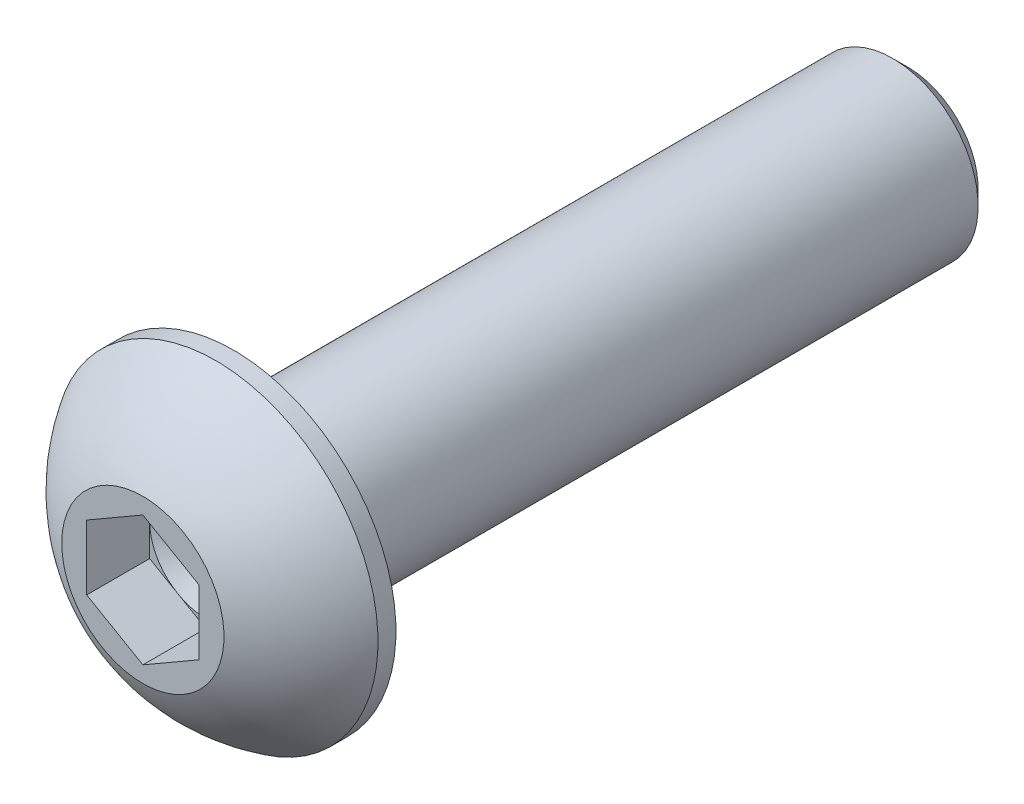
ISO-10303-21;
HEADER;
FILE_DESCRIPTION(('STEP AP214'),'2;1');
FILE_NAME('part.step','',(''),(''),'','','');
FILE_SCHEMA(('AUTOMOTIVE_DESIGN { 1 0 10303 214 1 1 1 1 }'));
ENDSEC;
DATA;
#1=APPLICATION_CONTEXT('core data for automotive mechanical design processes');
#2=APPLICATION_PROTOCOL_DEFINITION('international standard','automotive_design',2000,#1);
#3=PRODUCT_CONTEXT('',#1,'mechanical');
#4=PRODUCT('Part','Part','',(#3));
#5=PRODUCT_RELATED_PRODUCT_CATEGORY('part','',(#4));
#6=PRODUCT_DEFINITION_FORMATION('','',#4);
#7=PRODUCT_DEFINITION_CONTEXT('part definition',#1,'design');
#8=PRODUCT_DEFINITION('design','',#6,#7);
#9=PRODUCT_DEFINITION_SHAPE('','',#8);
#10=(LENGTH_UNIT() NAMED_UNIT(*) SI_UNIT(.MILLI.,.METRE.));
#11=(NAMED_UNIT(*) PLANE_ANGLE_UNIT() SI_UNIT($,.RADIAN.));
#12=(NAMED_UNIT(*) SI_UNIT($,.STERADIAN.) SOLID_ANGLE_UNIT());
#13=UNCERTAINTY_MEASURE_WITH_UNIT(LENGTH_MEASURE(1.E-05),#10,'distance_accuracy_value','');
#14=(GEOMETRIC_REPRESENTATION_CONTEXT(3) GLOBAL_UNCERTAINTY_ASSIGNED_CONTEXT((#13)) GLOBAL_UNIT_ASSIGNED_CONTEXT((#10,
#11,#12)) REPRESENTATION_CONTEXT('',''));
#15=CARTESIAN_POINT('',(0.,0.,0.));
#16=DIRECTION('',(0.,0.,1.));
#17=DIRECTION('',(1.,0.,0.));
#18=AXIS2_PLACEMENT_3D('',#15,#16,#17);
#19=CARTESIAN_POINT('',(0.,0.,-1.778));
#20=DIRECTION('',(0.,0.,1.));
#21=DIRECTION('',(1.,0.,0.));
#22=AXIS2_PLACEMENT_3D('',#19,#20,#21);
#23=PLANE('',#22);
#24=CARTESIAN_POINT('',(0.,0.,-1.778));
#25=DIRECTION('',(0.,0.,1.));
#26=DIRECTION('',(1.,0.,0.));
#27=AXIS2_PLACEMENT_3D('',#24,#25,#26);
#28=CIRCLE('',#27,1.5875);
#29=CARTESIAN_POINT('',(1.5875,0.,-1.778));
#30=VERTEX_POINT('',#29);
#31=CARTESIAN_POINT('',(0.79375,1.3748153285078,-1.778));
#32=VERTEX_POINT('',#31);
#33=EDGE_CURVE('E96',#30,#32,#28,.T.);
#34=ORIENTED_EDGE('',*,*,#33,.F.);
#35=DIRECTION('',(0.,-1.,0.));
#36=VECTOR('',#35,1.);
#37=CARTESIAN_POINT('',(1.5875,0.,-1.778));
#38=LINE('',#37,#36);
#39=CARTESIAN_POINT('',(1.5875,0.916543552338531,-1.778));
#40=VERTEX_POINT('',#39);
#41=EDGE_CURVE('E120',#40,#30,#38,.T.);
#42=ORIENTED_EDGE('',*,*,#41,.F.);
#43=DIRECTION('',(0.866025403784438,-0.5,0.));
#44=VECTOR('',#43,1.);
#45=CARTESIAN_POINT('',(0.79375,1.3748153285078,-1.778));
#46=LINE('',#45,#44);
#47=EDGE_CURVE('E118',#32,#40,#46,.T.);
#48=ORIENTED_EDGE('',*,*,#47,.F.);
#49=EDGE_LOOP('',(#34,#42,#48));
#50=FACE_BOUND('',#49,.T.);
#51=ADVANCED_FACE('F17',(#50),#23,.T.);
#52=CARTESIAN_POINT('',(-0.79375,1.37481532850779,-1.778));
#53=VERTEX_POINT('',#52);
#54=EDGE_CURVE('E98',#32,#53,#28,.T.);
#55=ORIENTED_EDGE('',*,*,#54,.F.);
#56=CARTESIAN_POINT('',(0.,1.83308710467706,-1.778));
#57=VERTEX_POINT('',#56);
#58=EDGE_CURVE('E113',#57,#32,#46,.T.);
#59=ORIENTED_EDGE('',*,*,#58,.F.);
#60=DIRECTION('',(0.866025403784437,0.5,0.));
#61=VECTOR('',#60,1.);
#62=CARTESIAN_POINT('',(-0.79375,1.37481532850779,-1.778));
#63=LINE('',#62,#61);
#64=EDGE_CURVE('E114',#53,#57,#63,.T.);
#65=ORIENTED_EDGE('',*,*,#64,.F.);
#66=EDGE_LOOP('',(#55,#59,#65));
#67=FACE_BOUND('',#66,.T.);
#68=ADVANCED_FACE('F111',(#67),#23,.T.);
#69=CARTESIAN_POINT('',(-1.5875,0.,-1.778));
#70=VERTEX_POINT('',#69);
#71=EDGE_CURVE('E117',#53,#70,#28,.T.);
#72=ORIENTED_EDGE('',*,*,#71,.F.);
#73=CARTESIAN_POINT('',(-1.5875,0.916543552338527,-1.778));
#74=VERTEX_POINT('',#73);
#75=EDGE_CURVE('E133',#74,#53,#63,.T.);
#76=ORIENTED_EDGE('',*,*,#75,.F.);
#77=DIRECTION('',(0.,1.,0.));
#78=VECTOR('',#77,1.);
#79=CARTESIAN_POINT('',(-1.5875,0.,-1.778));
#80=LINE('',#79,#78);
#81=EDGE_CURVE('E137',#70,#74,#80,.T.);
#82=ORIENTED_EDGE('',*,*,#81,.F.);
#83=EDGE_LOOP('',(#72,#76,#82));
#84=FACE_BOUND('',#83,.T.);
#85=ADVANCED_FACE('F227',(#84),#23,.T.);
#86=CARTESIAN_POINT('',(-0.79375,-1.3748153285078,-1.778));
#87=VERTEX_POINT('',#86);
#88=EDGE_CURVE('E252',#70,#87,#28,.T.);
#89=ORIENTED_EDGE('',*,*,#88,.F.);
#90=CARTESIAN_POINT('',(-1.5875,-0.916543552338531,-1.778));
#91=VERTEX_POINT('',#90);
#92=EDGE_CURVE('E138',#91,#70,#80,.T.);
#93=ORIENTED_EDGE('',*,*,#92,.F.);
#94=DIRECTION('',(-0.866025403784438,0.5,0.));
#95=VECTOR('',#94,1.);
#96=CARTESIAN_POINT('',(-0.79375,-1.3748153285078,-1.778));
#97=LINE('',#96,#95);
#98=EDGE_CURVE('E142',#87,#91,#97,.T.);
#99=ORIENTED_EDGE('',*,*,#98,.F.);
#100=EDGE_LOOP('',(#89,#93,#99));
#101=FACE_BOUND('',#100,.T.);
#102=ADVANCED_FACE('F239',(#101),#23,.T.);
#103=CARTESIAN_POINT('',(0.79375,-1.37481532850779,-1.778));
#104=VERTEX_POINT('',#103);
#105=EDGE_CURVE('E33',#87,#104,#28,.T.);
#106=ORIENTED_EDGE('',*,*,#105,.F.);
#107=CARTESIAN_POINT('',(0.,-1.83308710467706,-1.778));
#108=VERTEX_POINT('',#107);
#109=EDGE_CURVE('E143',#108,#87,#97,.T.);
#110=ORIENTED_EDGE('',*,*,#109,.F.);
#111=DIRECTION('',(-0.866025403784437,-0.5,0.));
#112=VECTOR('',#111,1.);
#113=CARTESIAN_POINT('',(0.79375,-1.37481532850779,-1.778));
#114=LINE('',#113,#112);
#115=EDGE_CURVE('E147',#104,#108,#114,.T.);
#116=ORIENTED_EDGE('',*,*,#115,.F.);
#117=EDGE_LOOP('',(#106,#110,#116));
#118=FACE_BOUND('',#117,.T.);
#119=ADVANCED_FACE('F232',(#118),#23,.T.);
#120=CARTESIAN_POINT('',(-1.146175,0.,0.));
#121=DIRECTION('',(0.,0.,1.));
#122=DIRECTION('',(1.,0.,0.));
#123=AXIS2_PLACEMENT_3D('',#120,#121,#122);
#124=PLANE('',#123);
#125=CARTESIAN_POINT('',(0.,0.,0.));
#126=DIRECTION('',(0.,0.,-1.));
#127=DIRECTION('',(-1.,0.,0.));
#128=AXIS2_PLACEMENT_3D('',#125,#126,#127);
#129=CIRCLE('',#128,2.29235);
#130=CARTESIAN_POINT('',(-2.29235000000001,0.,0.));
#131=VERTEX_POINT('',#130);
#132=EDGE_CURVE('E196',#131,#131,#129,.T.);
#133=ORIENTED_EDGE('',*,*,#132,.F.);
#134=EDGE_LOOP('',(#133));
#135=FACE_BOUND('',#134,.T.);
#136=DIRECTION('',(0.866025403784437,0.5,0.));
#137=VECTOR('',#136,1.);
#138=CARTESIAN_POINT('',(-0.79375,1.37481532850779,0.));
#139=LINE('',#138,#137);
#140=CARTESIAN_POINT('',(-1.5875,0.916543552338527,0.));
#141=VERTEX_POINT('',#140);
#142=CARTESIAN_POINT('',(0.,1.83308710467706,0.));
#143=VERTEX_POINT('',#142);
#144=EDGE_CURVE('E159',#141,#143,#139,.T.);
#145=ORIENTED_EDGE('',*,*,#144,.T.);
#146=DIRECTION('',(0.866025403784438,-0.5,0.));
#147=VECTOR('',#146,1.);
#148=CARTESIAN_POINT('',(0.79375,1.3748153285078,0.));
#149=LINE('',#148,#147);
#150=CARTESIAN_POINT('',(1.5875,0.916543552338531,0.));
#151=VERTEX_POINT('',#150);
#152=EDGE_CURVE('E106',#143,#151,#149,.T.);
#153=ORIENTED_EDGE('',*,*,#152,.T.);
#154=DIRECTION('',(0.,-1.,0.));
#155=VECTOR('',#154,1.);
#156=CARTESIAN_POINT('',(1.5875,0.,0.));
#157=LINE('',#156,#155);
#158=CARTESIAN_POINT('',(1.5875,-0.916543552338531,0.));
#159=VERTEX_POINT('',#158);
#160=EDGE_CURVE('E124',#151,#159,#157,.T.);
#161=ORIENTED_EDGE('',*,*,#160,.T.);
#162=DIRECTION('',(-0.866025403784437,-0.5,0.));
#163=VECTOR('',#162,1.);
#164=CARTESIAN_POINT('',(0.79375,-1.37481532850779,0.));
#165=LINE('',#164,#163);
#166=CARTESIAN_POINT('',(0.,-1.83308710467706,0.));
#167=VERTEX_POINT('',#166);
#168=EDGE_CURVE('E41',#159,#167,#165,.T.);
#169=ORIENTED_EDGE('',*,*,#168,.T.);
#170=DIRECTION('',(-0.866025403784438,0.5,0.));
#171=VECTOR('',#170,1.);
#172=CARTESIAN_POINT('',(-0.79375,-1.3748153285078,0.));
#173=LINE('',#172,#171);
#174=CARTESIAN_POINT('',(-1.5875,-0.916543552338531,0.));
#175=VERTEX_POINT('',#174);
#176=EDGE_CURVE('E167',#167,#175,#173,.T.);
#177=ORIENTED_EDGE('',*,*,#176,.T.);
#178=DIRECTION('',(0.,1.,0.));
#179=VECTOR('',#178,1.);
#180=CARTESIAN_POINT('',(-1.5875,0.,0.));
#181=LINE('',#180,#179);
#182=EDGE_CURVE('E163',#175,#141,#181,.T.);
#183=ORIENTED_EDGE('',*,*,#182,.T.);
#184=EDGE_LOOP('',(#145,#153,#161,#169,#177,#183));
#185=FACE_BOUND('',#184,.T.);
#186=ADVANCED_FACE('F238',(#135,#185),#124,.T.);
#187=CARTESIAN_POINT('',(0.,0.,1.48381805047393));
#188=DIRECTION('',(0.,0.,-1.));
#189=DIRECTION('',(-1.,0.,0.));
#190=AXIS2_PLACEMENT_3D('',#187,#188,#189);
#191=CYLINDRICAL_SURFACE('',#190,4.5847);
#192=CARTESIAN_POINT('',(0.,0.,-2.0574));
#193=DIRECTION('',(0.,0.,-1.));
#194=DIRECTION('',(-1.,0.,0.));
#195=AXIS2_PLACEMENT_3D('',#192,#193,#194);
#196=CIRCLE('',#195,4.5847);
#197=CARTESIAN_POINT('',(-4.5847,0.,-2.0574));
#198=VERTEX_POINT('',#197);
#199=EDGE_CURVE('E192',#198,#198,#196,.T.);
#200=ORIENTED_EDGE('',*,*,#199,.T.);
#201=EDGE_LOOP('',(#200));
#202=FACE_BOUND('',#201,.T.);
#203=CARTESIAN_POINT('',(0.,0.,-2.5654));
#204=DIRECTION('',(0.,0.,-1.));
#205=DIRECTION('',(-1.,0.,0.));
#206=AXIS2_PLACEMENT_3D('',#203,#204,#205);
#207=CIRCLE('',#206,4.5847);
#208=CARTESIAN_POINT('',(-4.5847,0.,-2.5654));
#209=VERTEX_POINT('',#208);
#210=EDGE_CURVE('E208',#209,#209,#207,.T.);
#211=ORIENTED_EDGE('',*,*,#210,.F.);
#212=EDGE_LOOP('',(#211));
#213=FACE_BOUND('',#212,.T.);
#214=ADVANCED_FACE('F244',(#202,#213),#191,.T.);
#215=CARTESIAN_POINT('',(-3.68935,0.,-2.5654));
#216=DIRECTION('',(0.,0.,-1.));
#217=DIRECTION('',(-1.,0.,0.));
#218=AXIS2_PLACEMENT_3D('',#215,#216,#217);
#219=PLANE('',#218);
#220=ORIENTED_EDGE('',*,*,#210,.T.);
#221=EDGE_LOOP('',(#220));
#222=FACE_BOUND('',#221,.T.);
#223=CARTESIAN_POINT('',(0.,0.,-2.5654));
#224=DIRECTION('',(0.,0.,-1.));
#225=DIRECTION('',(-1.,0.,0.));
#226=AXIS2_PLACEMENT_3D('',#223,#224,#225);
#227=CIRCLE('',#226,2.794);
#228=CARTESIAN_POINT('',(-2.794,0.,-2.5654));
#229=VERTEX_POINT('',#228);
#230=EDGE_CURVE('E204',#229,#229,#227,.T.);
#231=ORIENTED_EDGE('',*,*,#230,.F.);
#232=EDGE_LOOP('',(#231));
#233=FACE_BOUND('',#232,.T.);
#234=ADVANCED_FACE('F303',(#222,#233),#219,.T.);
#235=CARTESIAN_POINT('',(0.,0.,-2.9464));
#236=DIRECTION('',(0.,0.,-1.));
#237=DIRECTION('',(-1.,0.,0.));
#238=AXIS2_PLACEMENT_3D('',#235,#236,#237);
#239=TOROIDAL_SURFACE('',#238,2.794,0.381);
#240=ORIENTED_EDGE('',*,*,#230,.T.);
#241=EDGE_LOOP('',(#240));
#242=FACE_BOUND('',#241,.T.);
#243=CARTESIAN_POINT('',(0.,0.,-2.9464));
#244=DIRECTION('',(0.,0.,-1.));
#245=DIRECTION('',(-1.,0.,0.));
#246=AXIS2_PLACEMENT_3D('',#243,#244,#245);
#247=CIRCLE('',#246,2.413);
#248=CARTESIAN_POINT('',(-2.413,0.,-2.9464));
#249=VERTEX_POINT('',#248);
#250=EDGE_CURVE('E200',#249,#249,#247,.T.);
#251=ORIENTED_EDGE('',*,*,#250,.F.);
#252=EDGE_LOOP('',(#251));
#253=FACE_BOUND('',#252,.T.);
#254=ADVANCED_FACE('F299',(#242,#253),#239,.F.);
#255=CARTESIAN_POINT('',(0.,0.,1.48381805047393));
#256=DIRECTION('',(0.,0.,-1.));
#257=DIRECTION('',(-1.,0.,0.));
#258=AXIS2_PLACEMENT_3D('',#255,#256,#257);
#259=CYLINDRICAL_SURFACE('',#258,2.413);
#260=CARTESIAN_POINT('',(0.,0.,-21.18645761938));
#261=DIRECTION('',(0.,0.,-1.));
#262=DIRECTION('',(-1.,0.,0.));
#263=AXIS2_PLACEMENT_3D('',#260,#261,#262);
#264=CIRCLE('',#263,2.413);
#265=CARTESIAN_POINT('',(-2.413,0.,-21.18645761938));
#266=VERTEX_POINT('',#265);
#267=EDGE_CURVE('E11',#266,#266,#264,.F.);
#268=ORIENTED_EDGE('',*,*,#267,.T.);
#269=EDGE_LOOP('',(#268));
#270=FACE_BOUND('',#269,.T.);
#271=ORIENTED_EDGE('',*,*,#250,.T.);
#272=EDGE_LOOP('',(#271));
#273=FACE_BOUND('',#272,.T.);
#274=ADVANCED_FACE('F296',(#270,#273),#259,.T.);
#275=CARTESIAN_POINT('',(-1.2065,0.,-21.6154));
#276=DIRECTION('',(0.,0.,-1.));
#277=DIRECTION('',(-1.,0.,0.));
#278=AXIS2_PLACEMENT_3D('',#275,#276,#277);
#279=PLANE('',#278);
#280=CARTESIAN_POINT('',(0.,0.,-21.6154));
#281=DIRECTION('',(0.,0.,-1.));
#282=DIRECTION('',(-1.,0.,0.));
#283=AXIS2_PLACEMENT_3D('',#280,#281,#282);
#284=CIRCLE('',#283,1.98405761938);
#285=CARTESIAN_POINT('',(-1.98405761938,0.,-21.6154));
#286=VERTEX_POINT('',#285);
#287=EDGE_CURVE('E26',#286,#286,#284,.T.);
#288=ORIENTED_EDGE('',*,*,#287,.T.);
#289=EDGE_LOOP('',(#288));
#290=FACE_BOUND('',#289,.T.);
#291=ADVANCED_FACE('F216',(#290),#279,.T.);
#292=CARTESIAN_POINT('',(0.,0.,-4.85989606481481));
#293=DIRECTION('',(0.,0.,-1.));
#294=DIRECTION('',(-1.,0.,0.));
#295=AXIS2_PLACEMENT_3D('',#292,#293,#294);
#296=SPHERICAL_SURFACE('',#295,5.37340285883187);
#297=CARTESIAN_POINT('',(-4.5847,0.,-2.0574));
#298=CARTESIAN_POINT('',(-4.56772775071365,0.,-2.02963444466225));
#299=CARTESIAN_POINT('',(-4.55050321576171,0.,-2.00202310563314));
#300=CARTESIAN_POINT('',(-4.51555538986232,0.,-1.94711789153313));
#301=CARTESIAN_POINT('',(-4.49783209891487,0.,-1.91982401646224));
#302=CARTESIAN_POINT('',(-4.4618925763601,0.,-1.8655627616196));
#303=CARTESIAN_POINT('',(-4.44367634475278,0.,-1.83859538184787));
#304=CARTESIAN_POINT('',(-4.40675696303686,0.,-1.78499601309644));
#305=CARTESIAN_POINT('',(-4.38805381292827,0.,-1.75836402411674));
#306=CARTESIAN_POINT('',(-4.35016676527117,0.,-1.70544422925954));
#307=CARTESIAN_POINT('',(-4.33098286772266,0.,-1.67915642338203));
#308=CARTESIAN_POINT('',(-4.29214065809995,0.,-1.62693367141508));
#309=CARTESIAN_POINT('',(-4.27248234602574,0.,-1.60099872532564));
#310=CARTESIAN_POINT('',(-4.23269779601254,0.,-1.54949025368841));
#311=CARTESIAN_POINT('',(-4.21257155807355,0.,-1.52391672814064));
#312=CARTESIAN_POINT('',(-4.17185779967265,0.,-1.4731395388975));
#313=CARTESIAN_POINT('',(-4.15127027921075,0.,-1.44793587520214));
#314=CARTESIAN_POINT('',(-4.10964075130566,0.,-1.39790672892889));
#315=CARTESIAN_POINT('',(-4.08859874386249,0.,-1.37308124635099));
#316=CARTESIAN_POINT('',(-4.04606718757048,0.,-1.32381665673685));
#317=CARTESIAN_POINT('',(-4.02457763872164,0.,-1.29937754970059));
#318=CARTESIAN_POINT('',(-3.98115809291457,0.,-1.25089377806135));
#319=CARTESIAN_POINT('',(-3.95922809595633,0.,-1.22684911345837));
#320=CARTESIAN_POINT('',(-3.91493489261154,0.,-1.1791621633785));
#321=CARTESIAN_POINT('',(-3.892571686225,0.,-1.15551987790161));
#322=CARTESIAN_POINT('',(-3.84741944569869,0.,-1.10864548994917));
#323=CARTESIAN_POINT('',(-3.82463041155893,0.,-1.08541338747362));
#324=CARTESIAN_POINT('',(-3.77863403775912,0.,-1.03936703400529));
#325=CARTESIAN_POINT('',(-3.75542669809908,0.,-1.01655278301252));
#326=CARTESIAN_POINT('',(-3.70860137356642,0.,-0.971349663066289));
#327=CARTESIAN_POINT('',(-3.68498338869382,0.,-0.94896079411283));
#328=CARTESIAN_POINT('',(-3.63734456959005,0.,-0.904615828391113));
#329=CARTESIAN_POINT('',(-3.61332373535889,0.,-0.882659731622856));
#330=CARTESIAN_POINT('',(-3.56488714636506,0.,-0.839187557567447));
#331=CARTESIAN_POINT('',(-3.54047139160238,0.,-0.817671480280295));
#332=CARTESIAN_POINT('',(-3.4912530207284,0.,-0.775086447240822));
#333=CARTESIAN_POINT('',(-3.4664504046171,0.,-0.754017491488501));
#334=CARTESIAN_POINT('',(-3.41646649792444,0.,-0.712333655985979));
#335=CARTESIAN_POINT('',(-3.39128520734309,0.,-0.691718776235777));
#336=CARTESIAN_POINT('',(-3.34055226358225,0.,-0.650949897322802));
#337=CARTESIAN_POINT('',(-3.31500061040276,0.,-0.630795898160027));
#338=CARTESIAN_POINT('',(-3.26353537556731,0.,-0.590955432879197));
#339=CARTESIAN_POINT('',(-3.23762179391134,0.,-0.57126896676114));
#340=CARTESIAN_POINT('',(-3.18544125571044,0.,-0.532370065703055));
#341=CARTESIAN_POINT('',(-3.15917429916551,0.,-0.513157630763025));
#342=CARTESIAN_POINT('',(-3.10629568141643,0.,-0.475213133725829));
#343=CARTESIAN_POINT('',(-3.07968402021229,0.,-0.456481071628663));
#344=CARTESIAN_POINT('',(-3.02612477715573,0.,-0.419503503378719));
#345=CARTESIAN_POINT('',(-2.99917719530331,0.,-0.40125799722594));
#346=CARTESIAN_POINT('',(-2.94495500583993,0.,-0.365259563367945));
#347=CARTESIAN_POINT('',(-2.91768039822897,0.,-0.347506635662729));
#348=CARTESIAN_POINT('',(-2.8628131600919,0.,-0.312499218594777));
#349=CARTESIAN_POINT('',(-2.83522052956579,0.,-0.295244729232041));
#350=CARTESIAN_POINT('',(-2.77972635338319,0.,-0.261239884283562));
#351=CARTESIAN_POINT('',(-2.75182480772671,0.,-0.244489528697819));
#352=CARTESIAN_POINT('',(-2.69572201115466,0.,-0.211498480091079));
#353=CARTESIAN_POINT('',(-2.6675207602391,0.,-0.195257787070081));
#354=CARTESIAN_POINT('',(-2.61082786150165,0.,-0.163291425052401));
#355=CARTESIAN_POINT('',(-2.58233621367977,0.,-0.147565756055718));
#356=CARTESIAN_POINT('',(-2.52507192700006,0.,-0.116634630180611));
#357=CARTESIAN_POINT('',(-2.49629928814224,0.,-0.101429173302187));
#358=CARTESIAN_POINT('',(-2.43848251180434,0.,-0.0715435006068001));
#359=CARTESIAN_POINT('',(-2.40943837432427,0.,-0.0568632847898376));
#360=CARTESIAN_POINT('',(-2.35108820593536,0.,-0.0280329029080984));
#361=CARTESIAN_POINT('',(-2.32178217502651,0.,-0.0138827368433216));
#362=CARTESIAN_POINT('',(-2.29235000000001,0.,0.));
#363=B_SPLINE_CURVE_WITH_KNOTS('',3,(#297,#298,#299,#300,#301,#302,#303,#304,#305,#306,#307,
#308,#309,#310,#311,#312,#313,#314,#315,#316,#317,#318,#319,#320,#321,#322,#323,#324,#325,#326,
#327,#328,#329,#330,#331,#332,#333,#334,#335,#336,#337,#338,#339,#340,#341,#342,#343,#344,#345,
#346,#347,#348,#349,#350,#351,#352,#353,#354,#355,#356,#357,#358,#359,#360,#361,#362),
.UNSPECIFIED.,.F.,.F.,(4,2,2,2,2,2,2,2,2,2,2,2,2,2,2,2,2,2,2,2,2,2,2,2,2,2,2,2,2,2,2,2,4),(0.,
0.09762472664678,0.195249453293559,0.292874179940339,0.390498906587117,0.488123633233897,
0.585748359880676,0.683373086527455,0.780997813174235,0.878622539821013,0.976247266467793,
1.07387199311457,1.17149671976135,1.26912144640813,1.36674617305491,1.46437089970169,
1.56199562634847,1.65962035299525,1.75724507964203,1.85486980628881,1.95249453293559,
2.05011925958237,2.14774398622914,2.24536871287592,2.3429934395227,2.44061816616948,
2.53824289281626,2.63586761946304,2.73349234610982,2.8311170727566,2.92874179940338,
3.02636652605016,3.12399125269694),.UNSPECIFIED.);
#364=EDGE_CURVE('BSEAM287',#198,#131,#363,.T.);
#365=ORIENTED_EDGE('',*,*,#199,.F.);
#366=ORIENTED_EDGE('',*,*,#132,.T.);
#367=ORIENTED_EDGE('',*,*,#364,.T.);
#368=ORIENTED_EDGE('',*,*,#364,.F.);
#369=EDGE_LOOP('',(#365,#367,#366,#368));
#370=FACE_BOUND('',#369,.T.);
#371=ADVANCED_FACE('F287',(#370),#296,.T.);
#372=CARTESIAN_POINT('',(0.79375,1.3748153285078,-1.778));
#373=DIRECTION('',(-0.5,-0.866025403784438,0.));
#374=DIRECTION('',(0.866025403784438,-0.5,0.));
#375=AXIS2_PLACEMENT_3D('',#372,#373,#374);
#376=PLANE('',#375);
#377=ORIENTED_EDGE('',*,*,#152,.F.);
#378=DIRECTION('',(0.,0.,1.));
#379=VECTOR('',#378,1.);
#380=CARTESIAN_POINT('',(0.,1.83308710467706,-1.778));
#381=LINE('',#380,#379);
#382=EDGE_CURVE('E129',#57,#143,#381,.T.);
#383=ORIENTED_EDGE('',*,*,#382,.F.);
#384=ORIENTED_EDGE('',*,*,#58,.T.);
#385=ORIENTED_EDGE('',*,*,#47,.T.);
#386=DIRECTION('',(0.,0.,1.));
#387=VECTOR('',#386,1.);
#388=CARTESIAN_POINT('',(1.5875,0.916543552338531,-1.778));
#389=LINE('',#388,#387);
#390=EDGE_CURVE('E155',#40,#151,#389,.T.);
#391=ORIENTED_EDGE('',*,*,#390,.T.);
#392=EDGE_LOOP('',(#377,#383,#384,#385,#391));
#393=FACE_BOUND('',#392,.T.);
#394=ADVANCED_FACE('F128',(#393),#376,.T.);
#395=CARTESIAN_POINT('',(-0.79375,1.37481532850779,-1.778));
#396=DIRECTION('',(0.5,-0.866025403784437,0.));
#397=DIRECTION('',(0.866025403784437,0.5,0.));
#398=AXIS2_PLACEMENT_3D('',#395,#396,#397);
#399=PLANE('',#398);
#400=ORIENTED_EDGE('',*,*,#144,.F.);
#401=DIRECTION('',(0.,0.,1.));
#402=VECTOR('',#401,1.);
#403=CARTESIAN_POINT('',(-1.5875,0.916543552338527,-1.778));
#404=LINE('',#403,#402);
#405=EDGE_CURVE('E187',#74,#141,#404,.T.);
#406=ORIENTED_EDGE('',*,*,#405,.F.);
#407=ORIENTED_EDGE('',*,*,#75,.T.);
#408=ORIENTED_EDGE('',*,*,#64,.T.);
#409=ORIENTED_EDGE('',*,*,#382,.T.);
#410=EDGE_LOOP('',(#400,#406,#407,#408,#409));
#411=FACE_BOUND('',#410,.T.);
#412=ADVANCED_FACE('F280',(#411),#399,.T.);
#413=CARTESIAN_POINT('',(-1.5875,0.,-1.778));
#414=DIRECTION('',(1.,0.,0.));
#415=DIRECTION('',(0.,0.,-1.));
#416=AXIS2_PLACEMENT_3D('',#413,#414,#415);
#417=PLANE('',#416);
#418=ORIENTED_EDGE('',*,*,#182,.F.);
#419=DIRECTION('',(0.,0.,1.));
#420=VECTOR('',#419,1.);
#421=CARTESIAN_POINT('',(-1.5875,-0.916543552338531,-1.778));
#422=LINE('',#421,#420);
#423=EDGE_CURVE('E184',#91,#175,#422,.T.);
#424=ORIENTED_EDGE('',*,*,#423,.F.);
#425=ORIENTED_EDGE('',*,*,#92,.T.);
#426=ORIENTED_EDGE('',*,*,#81,.T.);
#427=ORIENTED_EDGE('',*,*,#405,.T.);
#428=EDGE_LOOP('',(#418,#424,#425,#426,#427));
#429=FACE_BOUND('',#428,.T.);
#430=ADVANCED_FACE('F274',(#429),#417,.T.);
#431=CARTESIAN_POINT('',(-0.79375,-1.3748153285078,-1.778));
#432=DIRECTION('',(0.5,0.866025403784438,0.));
#433=DIRECTION('',(-0.866025403784438,0.5,0.));
#434=AXIS2_PLACEMENT_3D('',#431,#432,#433);
#435=PLANE('',#434);
#436=ORIENTED_EDGE('',*,*,#176,.F.);
#437=DIRECTION('',(0.,0.,1.));
#438=VECTOR('',#437,1.);
#439=CARTESIAN_POINT('',(0.,-1.83308710467706,-1.778));
#440=LINE('',#439,#438);
#441=EDGE_CURVE('E181',#108,#167,#440,.T.);
#442=ORIENTED_EDGE('',*,*,#441,.F.);
#443=ORIENTED_EDGE('',*,*,#109,.T.);
#444=ORIENTED_EDGE('',*,*,#98,.T.);
#445=ORIENTED_EDGE('',*,*,#423,.T.);
#446=EDGE_LOOP('',(#436,#442,#443,#444,#445));
#447=FACE_BOUND('',#446,.T.);
#448=ADVANCED_FACE('F261',(#447),#435,.T.);
#449=CARTESIAN_POINT('',(0.79375,-1.37481532850779,-1.778));
#450=DIRECTION('',(-0.5,0.866025403784437,0.));
#451=DIRECTION('',(-0.866025403784437,-0.5,0.));
#452=AXIS2_PLACEMENT_3D('',#449,#450,#451);
#453=PLANE('',#452);
#454=ORIENTED_EDGE('',*,*,#168,.F.);
#455=DIRECTION('',(0.,0.,1.));
#456=VECTOR('',#455,1.);
#457=CARTESIAN_POINT('',(1.5875,-0.916543552338531,-1.778));
#458=LINE('',#457,#456);
#459=CARTESIAN_POINT('',(1.5875,-0.916543552338531,-1.778));
#460=VERTEX_POINT('',#459);
#461=EDGE_CURVE('E178',#460,#159,#458,.T.);
#462=ORIENTED_EDGE('',*,*,#461,.F.);
#463=EDGE_CURVE('E148',#460,#104,#114,.T.);
#464=ORIENTED_EDGE('',*,*,#463,.T.);
#465=ORIENTED_EDGE('',*,*,#115,.T.);
#466=ORIENTED_EDGE('',*,*,#441,.T.);
#467=EDGE_LOOP('',(#454,#462,#464,#465,#466));
#468=FACE_BOUND('',#467,.T.);
#469=ADVANCED_FACE('F235',(#468),#453,.T.);
#470=CARTESIAN_POINT('',(1.5875,0.,-1.778));
#471=DIRECTION('',(-1.,0.,0.));
#472=DIRECTION('',(0.,0.,1.));
#473=AXIS2_PLACEMENT_3D('',#470,#471,#472);
#474=PLANE('',#473);
#475=ORIENTED_EDGE('',*,*,#160,.F.);
#476=ORIENTED_EDGE('',*,*,#390,.F.);
#477=ORIENTED_EDGE('',*,*,#41,.T.);
#478=EDGE_CURVE('E152',#30,#460,#38,.T.);
#479=ORIENTED_EDGE('',*,*,#478,.T.);
#480=ORIENTED_EDGE('',*,*,#461,.T.);
#481=EDGE_LOOP('',(#475,#476,#477,#479,#480));
#482=FACE_BOUND('',#481,.T.);
#483=ADVANCED_FACE('F230',(#482),#474,.T.);
#484=EDGE_CURVE('E100',#104,#30,#28,.T.);
#485=ORIENTED_EDGE('',*,*,#484,.F.);
#486=ORIENTED_EDGE('',*,*,#463,.F.);
#487=ORIENTED_EDGE('',*,*,#478,.F.);
#488=EDGE_LOOP('',(#485,#486,#487));
#489=FACE_BOUND('',#488,.T.);
#490=ADVANCED_FACE('F93',(#489),#23,.T.);
#491=CARTESIAN_POINT('',(0.,0.,-1.778));
#492=DIRECTION('',(0.,0.,1.));
#493=DIRECTION('',(1.,0.,0.));
#494=AXIS2_PLACEMENT_3D('',#491,#492,#493);
#495=CONICAL_SURFACE('',#494,1.5875,1.0471975511966);
#496=CARTESIAN_POINT('',(0.,0.,-2.69454355233854));
#497=VERTEX_POINT('',#496);
#498=VERTEX_LOOP('',#497);
#499=FACE_BOUND('',#498,.T.);
#500=ORIENTED_EDGE('',*,*,#33,.T.);
#501=ORIENTED_EDGE('',*,*,#54,.T.);
#502=ORIENTED_EDGE('',*,*,#71,.T.);
#503=ORIENTED_EDGE('',*,*,#88,.T.);
#504=ORIENTED_EDGE('',*,*,#105,.T.);
#505=ORIENTED_EDGE('',*,*,#484,.T.);
#506=EDGE_LOOP('',(#500,#501,#502,#503,#504,#505));
#507=FACE_BOUND('',#506,.T.);
#508=ADVANCED_FACE('F91',(#499,#507),#495,.F.);
#509=CARTESIAN_POINT('',(0.,0.,-21.6154));
#510=DIRECTION('',(0.,0.,1.));
#511=DIRECTION('',(1.,0.,0.));
#512=AXIS2_PLACEMENT_3D('',#509,#510,#511);
#513=CONICAL_SURFACE('',#512,1.98405761938,0.785398163397449);
#514=ORIENTED_EDGE('',*,*,#267,.F.);
#515=EDGE_LOOP('',(#514));
#516=FACE_BOUND('',#515,.T.);
#517=ORIENTED_EDGE('',*,*,#287,.F.);
#518=EDGE_LOOP('',(#517));
#519=FACE_BOUND('',#518,.T.);
#520=ADVANCED_FACE('F19',(#516,#519),#513,.T.);
#521=CLOSED_SHELL('',(#51,#68,#85,#102,#119,#186,#214,#234,#254,#274,#291,#371,#394,#412,#430,
#448,#469,#483,#490,#508,#520));
#522=MANIFOLD_SOLID_BREP('B1',#521);
#523=ADVANCED_BREP_SHAPE_REPRESENTATION('',(#18,#522),#14);
#524=SHAPE_DEFINITION_REPRESENTATION(#9,#523);
ENDSEC;
END-ISO-10303-21;
